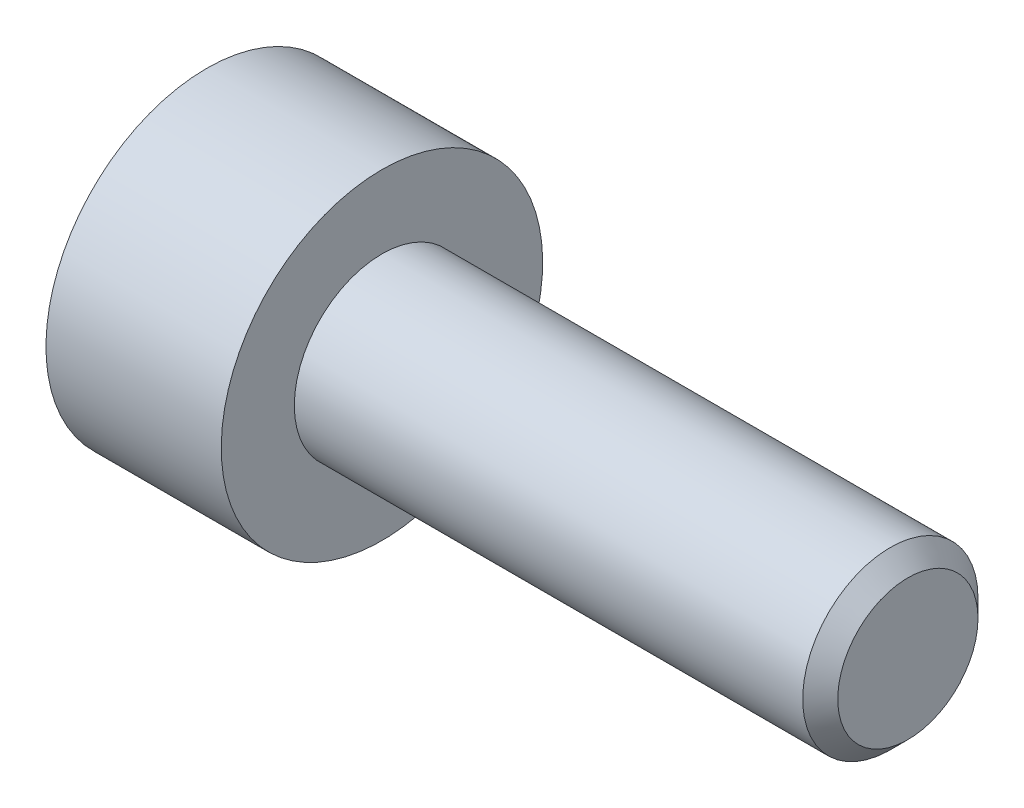
ISO-10303-21;
HEADER;
FILE_DESCRIPTION(('STEP AP214'),'2;1');
FILE_NAME('part.step','',(''),(''),'','','');
FILE_SCHEMA(('AUTOMOTIVE_DESIGN { 1 0 10303 214 1 1 1 1 }'));
ENDSEC;
DATA;
#1=APPLICATION_CONTEXT('core data for automotive mechanical design processes');
#2=APPLICATION_PROTOCOL_DEFINITION('international standard','automotive_design',2000,#1);
#3=PRODUCT_CONTEXT('',#1,'mechanical');
#4=PRODUCT('Part','Part','',(#3));
#5=PRODUCT_RELATED_PRODUCT_CATEGORY('part','',(#4));
#6=PRODUCT_DEFINITION_FORMATION('','',#4);
#7=PRODUCT_DEFINITION_CONTEXT('part definition',#1,'design');
#8=PRODUCT_DEFINITION('design','',#6,#7);
#9=PRODUCT_DEFINITION_SHAPE('','',#8);
#10=(LENGTH_UNIT() NAMED_UNIT(*) SI_UNIT(.MILLI.,.METRE.));
#11=(NAMED_UNIT(*) PLANE_ANGLE_UNIT() SI_UNIT($,.RADIAN.));
#12=(NAMED_UNIT(*) SI_UNIT($,.STERADIAN.) SOLID_ANGLE_UNIT());
#13=UNCERTAINTY_MEASURE_WITH_UNIT(LENGTH_MEASURE(1.E-05),#10,'distance_accuracy_value','');
#14=(GEOMETRIC_REPRESENTATION_CONTEXT(3) GLOBAL_UNCERTAINTY_ASSIGNED_CONTEXT((#13)) GLOBAL_UNIT_ASSIGNED_CONTEXT((#10,
#11,#12)) REPRESENTATION_CONTEXT('',''));
#15=CARTESIAN_POINT('',(0.,0.,0.));
#16=DIRECTION('',(0.,0.,1.));
#17=DIRECTION('',(1.,0.,0.));
#18=AXIS2_PLACEMENT_3D('',#15,#16,#17);
#19=CARTESIAN_POINT('',(-9.,0.,0.));
#20=DIRECTION('',(1.,0.,0.));
#21=DIRECTION('',(0.,0.,-1.));
#22=AXIS2_PLACEMENT_3D('',#19,#20,#21);
#23=CYLINDRICAL_SURFACE('',#22,1.5);
#24=CARTESIAN_POINT('',(-0.299999999999998,0.,0.));
#25=DIRECTION('',(1.,0.,0.));
#26=DIRECTION('',(0.,0.,-1.));
#27=AXIS2_PLACEMENT_3D('',#24,#25,#26);
#28=CIRCLE('',#27,1.5);
#29=CARTESIAN_POINT('',(-0.299999999999998,0.,-1.5));
#30=VERTEX_POINT('',#29);
#31=EDGE_CURVE('E55',#30,#30,#28,.F.);
#32=ORIENTED_EDGE('',*,*,#31,.T.);
#33=EDGE_LOOP('',(#32));
#34=FACE_BOUND('',#33,.T.);
#35=CARTESIAN_POINT('',(-9.,0.,0.));
#36=DIRECTION('',(1.,0.,0.));
#37=DIRECTION('',(0.,1.,0.));
#38=AXIS2_PLACEMENT_3D('',#35,#36,#37);
#39=CIRCLE('',#38,1.5);
#40=CARTESIAN_POINT('',(-9.,1.49999999999999,0.));
#41=VERTEX_POINT('',#40);
#42=EDGE_CURVE('E131',#41,#41,#39,.F.);
#43=ORIENTED_EDGE('',*,*,#42,.F.);
#44=EDGE_LOOP('',(#43));
#45=FACE_BOUND('',#44,.T.);
#46=ADVANCED_FACE('F41',(#34,#45),#23,.T.);
#47=CARTESIAN_POINT('',(0.,0.,0.));
#48=DIRECTION('',(1.,0.,0.));
#49=DIRECTION('',(0.,0.,-1.));
#50=AXIS2_PLACEMENT_3D('',#47,#48,#49);
#51=PLANE('',#50);
#52=CARTESIAN_POINT('',(0.,0.,0.));
#53=DIRECTION('',(1.,0.,0.));
#54=DIRECTION('',(0.,0.,-1.));
#55=AXIS2_PLACEMENT_3D('',#52,#53,#54);
#56=CIRCLE('',#55,1.2);
#57=CARTESIAN_POINT('',(0.,0.,-1.2));
#58=VERTEX_POINT('',#57);
#59=EDGE_CURVE('E134',#58,#58,#56,.T.);
#60=ORIENTED_EDGE('',*,*,#59,.T.);
#61=EDGE_LOOP('',(#60));
#62=FACE_BOUND('',#61,.T.);
#63=ADVANCED_FACE('F144',(#62),#51,.T.);
#64=CARTESIAN_POINT('',(0.,0.,0.));
#65=DIRECTION('',(-1.,0.,0.));
#66=DIRECTION('',(0.,0.,1.));
#67=AXIS2_PLACEMENT_3D('',#64,#65,#66);
#68=CONICAL_SURFACE('',#67,1.2,0.785398163397449);
#69=ORIENTED_EDGE('',*,*,#31,.F.);
#70=EDGE_LOOP('',(#69));
#71=FACE_BOUND('',#70,.T.);
#72=ORIENTED_EDGE('',*,*,#59,.F.);
#73=EDGE_LOOP('',(#72));
#74=FACE_BOUND('',#73,.T.);
#75=ADVANCED_FACE('F43',(#71,#74),#68,.T.);
#76=CARTESIAN_POINT('',(-12.,0.,0.));
#77=DIRECTION('',(-1.,0.,0.));
#78=DIRECTION('',(0.,-1.,0.));
#79=AXIS2_PLACEMENT_3D('',#76,#77,#78);
#80=PLANE('',#79);
#81=CARTESIAN_POINT('',(-12.,0.,0.));
#82=DIRECTION('',(-1.,0.,0.));
#83=DIRECTION('',(0.,-1.,0.));
#84=AXIS2_PLACEMENT_3D('',#81,#82,#83);
#85=CIRCLE('',#84,1.49337567297408);
#86=CARTESIAN_POINT('',(-12.,-1.49337567297405,0.));
#87=VERTEX_POINT('',#86);
#88=EDGE_CURVE('E249',#87,#87,#85,.T.);
#89=ORIENTED_EDGE('',*,*,#88,.F.);
#90=EDGE_LOOP('',(#89));
#91=FACE_BOUND('',#90,.T.);
#92=CARTESIAN_POINT('',(-12.,0.,0.));
#93=DIRECTION('',(1.,0.,0.));
#94=DIRECTION('',(0.,1.,0.));
#95=AXIS2_PLACEMENT_3D('',#92,#93,#94);
#96=CIRCLE('',#95,2.75);
#97=CARTESIAN_POINT('',(-12.,2.75,0.));
#98=VERTEX_POINT('',#97);
#99=EDGE_CURVE('E128',#98,#98,#96,.T.);
#100=ORIENTED_EDGE('',*,*,#99,.F.);
#101=EDGE_LOOP('',(#100));
#102=FACE_BOUND('',#101,.T.);
#103=ADVANCED_FACE('F143',(#91,#102),#80,.T.);
#104=CARTESIAN_POINT('',(-9.,0.,0.));
#105=DIRECTION('',(1.,0.,0.));
#106=DIRECTION('',(0.,1.,0.));
#107=AXIS2_PLACEMENT_3D('',#104,#105,#106);
#108=CYLINDRICAL_SURFACE('',#107,2.75);
#109=ORIENTED_EDGE('',*,*,#99,.T.);
#110=EDGE_LOOP('',(#109));
#111=FACE_BOUND('',#110,.T.);
#112=CARTESIAN_POINT('',(-9.,0.,0.));
#113=DIRECTION('',(1.,0.,0.));
#114=DIRECTION('',(0.,1.,0.));
#115=AXIS2_PLACEMENT_3D('',#112,#113,#114);
#116=CIRCLE('',#115,2.75);
#117=CARTESIAN_POINT('',(-9.,2.75,0.));
#118=VERTEX_POINT('',#117);
#119=EDGE_CURVE('E125',#118,#118,#116,.T.);
#120=ORIENTED_EDGE('',*,*,#119,.F.);
#121=EDGE_LOOP('',(#120));
#122=FACE_BOUND('',#121,.T.);
#123=ADVANCED_FACE('F155',(#111,#122),#108,.T.);
#124=CARTESIAN_POINT('',(-9.,2.75,0.));
#125=DIRECTION('',(1.,0.,0.));
#126=DIRECTION('',(0.,1.,0.));
#127=AXIS2_PLACEMENT_3D('',#124,#125,#126);
#128=PLANE('',#127);
#129=ORIENTED_EDGE('',*,*,#42,.T.);
#130=EDGE_LOOP('',(#129));
#131=FACE_BOUND('',#130,.T.);
#132=ORIENTED_EDGE('',*,*,#119,.T.);
#133=EDGE_LOOP('',(#132));
#134=FACE_BOUND('',#133,.T.);
#135=ADVANCED_FACE('F159',(#131,#134),#128,.T.);
#136=CARTESIAN_POINT('',(-12.,0.,0.));
#137=DIRECTION('',(-1.,0.,0.));
#138=DIRECTION('',(0.,-1.,0.));
#139=AXIS2_PLACEMENT_3D('',#136,#137,#138);
#140=CONICAL_SURFACE('',#139,1.49337567297408,0.78539816339745);
#141=ORIENTED_EDGE('',*,*,#88,.T.);
#142=EDGE_LOOP('',(#141));
#143=FACE_BOUND('',#142,.T.);
#144=CARTESIAN_POINT('',(-12.4014021689884,-1.42396736984798,1.25));
#145=CARTESIAN_POINT('',(-12.375296136448,-1.38922450814774,1.25));
#146=CARTESIAN_POINT('',(-12.3494506563431,-1.35428640192996,1.25));
#147=CARTESIAN_POINT('',(-12.2983879120234,-1.28394100441962,1.25));
#148=CARTESIAN_POINT('',(-12.2731708093588,-1.24853359598576,1.25));
#149=CARTESIAN_POINT('',(-12.1982633539511,-1.1409714001612,1.25));
#150=CARTESIAN_POINT('',(-12.1497190435972,-1.0680049582675,1.25));
#151=CARTESIAN_POINT('',(-12.0545600162985,-0.915095472420351,1.25));
#152=CARTESIAN_POINT('',(-12.0082030382604,-0.834990154954494,1.25));
#153=CARTESIAN_POINT('',(-11.9235039270025,-0.670798348959411,1.25));
#154=CARTESIAN_POINT('',(-11.8851347978723,-0.586726487937158,1.25));
#155=CARTESIAN_POINT('',(-11.8381985020476,-0.460385334768696,1.25));
#156=CARTESIAN_POINT('',(-11.8247021207698,-0.419954113336602,1.25));
#157=CARTESIAN_POINT('',(-11.8009573074475,-0.33812903129128,1.25));
#158=CARTESIAN_POINT('',(-11.7907091035293,-0.296735103284172,1.25));
#159=CARTESIAN_POINT('',(-11.7741594663552,-0.213916243687786,1.25));
#160=CARTESIAN_POINT('',(-11.7677913385525,-0.172504848949334,1.25));
#161=CARTESIAN_POINT('',(-11.7591237196608,-0.0892560954741912,1.25));
#162=CARTESIAN_POINT('',(-11.7568235599982,-0.0474188078702989,1.25));
#163=CARTESIAN_POINT('',(-11.7564564105193,0.0348235296905082,1.25));
#164=CARTESIAN_POINT('',(-11.7582455485416,0.0752279922916852,1.25));
#165=CARTESIAN_POINT('',(-11.7656448035135,0.155687005579614,1.25));
#166=CARTESIAN_POINT('',(-11.7712556629701,0.195741486737968,1.25));
#167=CARTESIAN_POINT('',(-11.7860898151071,0.275882483894676,1.25));
#168=CARTESIAN_POINT('',(-11.7953738895404,0.31595757967878,1.25));
#169=CARTESIAN_POINT('',(-11.8170656964992,0.395234027395288,1.25));
#170=CARTESIAN_POINT('',(-11.8294731489784,0.434435457318928,1.25));
#171=CARTESIAN_POINT('',(-11.8734108304631,0.558570325397127,1.25));
#172=CARTESIAN_POINT('',(-11.9099744143289,0.641718054005948,1.25));
#173=CARTESIAN_POINT('',(-11.9912478873066,0.804100725662089,1.25));
#174=CARTESIAN_POINT('',(-12.0359871895297,0.883320183915879,1.25));
#175=CARTESIAN_POINT('',(-12.1282652286461,1.03470895505823,1.25));
#176=CARTESIAN_POINT('',(-12.1755534388818,1.10703287925038,1.25));
#177=CARTESIAN_POINT('',(-12.2486463209253,1.21358798649192,1.25));
#178=CARTESIAN_POINT('',(-12.2732664432996,1.24864609054882,1.25));
#179=CARTESIAN_POINT('',(-12.323155260131,1.31828380805649,1.25));
#180=CARTESIAN_POINT('',(-12.3484237758017,1.35286354944694,1.25));
#181=CARTESIAN_POINT('',(-12.3739610581168,1.38724419886388,1.25));
#182=B_SPLINE_CURVE_WITH_KNOTS('',3,(#144,#145,#146,#147,#148,#149,#150,#151,#152,#153,#154,
#155,#156,#157,#158,#159,#160,#161,#162,#163,#164,#165,#166,#167,#168,#169,#170,#171,#172,#173,
#174,#175,#176,#177,#178,#179,#180,#181),.UNSPECIFIED.,.F.,.F.,(4,2,2,2,2,2,2,2,2,2,2,2,2,2,2,2,
2,2,4),(0.,0.130370422461748,0.260774023229279,0.523571931962181,0.800995227642792,
1.07746514553942,1.20522972687283,1.33300327939672,1.45851355132216,1.5840031936199,
1.70514602294322,1.82631239533597,1.94957373840993,2.07282403363807,2.34451838945522,
2.61721016161585,2.87631588769063,3.00482945023601,3.13330794967363),.UNSPECIFIED.);
#183=CARTESIAN_POINT('',(-11.95,-0.721687836486997,1.25));
#184=VERTEX_POINT('',#183);
#185=CARTESIAN_POINT('',(-11.95,0.721687836487068,1.25));
#186=VERTEX_POINT('',#185);
#187=EDGE_CURVE('E109',#184,#186,#182,.T.);
#188=ORIENTED_EDGE('',*,*,#187,.F.);
#189=CARTESIAN_POINT('',(-11.9501154839091,-1.44349114302787,-0.000200000000000609));
#190=CARTESIAN_POINT('',(-11.9253216680551,-1.41867941875062,0.0427751670715862));
#191=CARTESIAN_POINT('',(-11.9019837344187,-1.3934527698074,0.0864690047459474));
#192=CARTESIAN_POINT('',(-11.8592520040845,-1.34201263554191,0.175565930841941));
#193=CARTESIAN_POINT('',(-11.8398819923604,-1.31579425481273,0.220977498357063));
#194=CARTESIAN_POINT('',(-11.8067004834135,-1.26292610442243,0.312547820935259));
#195=CARTESIAN_POINT('',(-11.7928055590526,-1.23628980770467,0.358683240175885));
#196=CARTESIAN_POINT('',(-11.7713972821606,-1.18243062538505,0.451970080407592));
#197=CARTESIAN_POINT('',(-11.7638679415668,-1.15520938653758,0.499118649136379));
#198=CARTESIAN_POINT('',(-11.7570744980507,-1.10829684367463,0.580373556887252));
#199=CARTESIAN_POINT('',(-11.7560685591043,-1.08866617256954,0.61437487662794));
#200=CARTESIAN_POINT('',(-11.7577614149113,-1.04943932800607,0.682317764432477));
#201=CARTESIAN_POINT('',(-11.7604610272155,-1.02984316311596,0.716259317655657));
#202=CARTESIAN_POINT('',(-11.7694089303164,-0.990839954603464,0.783814856457499));
#203=CARTESIAN_POINT('',(-11.7756605258997,-0.971433104248736,0.817428507286774));
#204=CARTESIAN_POINT('',(-11.7913756814139,-0.93294339560987,0.884094638217813));
#205=CARTESIAN_POINT('',(-11.8008406200874,-0.913860680098265,0.917146871030295));
#206=CARTESIAN_POINT('',(-11.8289313906876,-0.864986351354532,1.00179969160026));
#207=CARTESIAN_POINT('',(-11.8496701574522,-0.83550292014904,1.05286649242964));
#208=CARTESIAN_POINT('',(-11.8963871346715,-0.777690319475873,1.15300085411325));
#209=CARTESIAN_POINT('',(-11.9223482959468,-0.749357745598381,1.20207431157827));
#210=CARTESIAN_POINT('',(-11.9501154839091,-0.721572366433159,1.2502));
#211=B_SPLINE_CURVE_WITH_KNOTS('',3,(#189,#190,#191,#192,#193,#194,#195,#196,#197,#198,#199,
#200,#201,#202,#203,#204,#205,#206,#207,#208,#209,#210),.UNSPECIFIED.,.F.,.F.,(4,2,2,2,2,2,2,2,
2,2,4),(0.,0.166533409618303,0.334037607289761,0.498880396489698,0.663307919240275,
0.780963963458827,0.898645970148453,1.01643764860773,1.1342799317155,1.32148652032141,
1.50809158792574),.UNSPECIFIED.);
#212=CARTESIAN_POINT('',(-11.95,-1.44337567297403,0.));
#213=VERTEX_POINT('',#212);
#214=EDGE_CURVE('E205',#213,#184,#211,.T.);
#215=ORIENTED_EDGE('',*,*,#214,.F.);
#216=CARTESIAN_POINT('',(-11.9501154839091,-0.721572366433158,-1.2502));
#217=CARTESIAN_POINT('',(-11.9253216680551,-0.746384090710407,-1.20722483292841));
#218=CARTESIAN_POINT('',(-11.9019837344187,-0.771610739653628,-1.16353099525405));
#219=CARTESIAN_POINT('',(-11.8592520040845,-0.823050873919118,-1.07443406915806));
#220=CARTESIAN_POINT('',(-11.8398819923604,-0.849269254648297,-1.02902250164294));
#221=CARTESIAN_POINT('',(-11.8067004834135,-0.902137405038599,-0.937452179064741));
#222=CARTESIAN_POINT('',(-11.7928055590526,-0.928773701756351,-0.891316759824115));
#223=CARTESIAN_POINT('',(-11.7713972821606,-0.982632884075976,-0.798029919592408));
#224=CARTESIAN_POINT('',(-11.7638679415668,-1.00985412292345,-0.750881350863621));
#225=CARTESIAN_POINT('',(-11.7570744980507,-1.05676666578639,-0.669626443112748));
#226=CARTESIAN_POINT('',(-11.7560685591043,-1.07639733689148,-0.63562512337206));
#227=CARTESIAN_POINT('',(-11.7577614149113,-1.11562418145495,-0.567682235567523));
#228=CARTESIAN_POINT('',(-11.7604610272155,-1.13522034634507,-0.533740682344343));
#229=CARTESIAN_POINT('',(-11.7694089303164,-1.17422355485756,-0.466185143542501));
#230=CARTESIAN_POINT('',(-11.7756605258997,-1.19363040521229,-0.432571492713226));
#231=CARTESIAN_POINT('',(-11.7913756814139,-1.23212011385116,-0.365905361782188));
#232=CARTESIAN_POINT('',(-11.8008406200874,-1.25120282936276,-0.332853128969705));
#233=CARTESIAN_POINT('',(-11.8289313906876,-1.30007715810649,-0.248200308399736));
#234=CARTESIAN_POINT('',(-11.8496701574522,-1.32956058931199,-0.197133507570362));
#235=CARTESIAN_POINT('',(-11.8963871346715,-1.38737318998515,-0.0969991458867454));
#236=CARTESIAN_POINT('',(-11.9223482959468,-1.41570576386264,-0.0479256884217309));
#237=CARTESIAN_POINT('',(-11.9501154839091,-1.44349114302787,0.000199999999999419));
#238=B_SPLINE_CURVE_WITH_KNOTS('',3,(#216,#217,#218,#219,#220,#221,#222,#223,#224,#225,#226,
#227,#228,#229,#230,#231,#232,#233,#234,#235,#236,#237),.UNSPECIFIED.,.F.,.F.,(4,2,2,2,2,2,2,2,
2,2,4),(0.,0.166533409618304,0.334037607289761,0.498880396489697,0.663307919240274,
0.780963963458826,0.898645970148452,1.01643764860773,1.13427993171549,1.32148652032141,
1.50809158792573),.UNSPECIFIED.);
#239=CARTESIAN_POINT('',(-11.95,-0.721687836486996,-1.25));
#240=VERTEX_POINT('',#239);
#241=EDGE_CURVE('E199',#240,#213,#238,.T.);
#242=ORIENTED_EDGE('',*,*,#241,.F.);
#243=CARTESIAN_POINT('',(-12.4014021689884,-1.42396736984798,-1.25));
#244=CARTESIAN_POINT('',(-12.375296136448,-1.38922450814774,-1.25));
#245=CARTESIAN_POINT('',(-12.3494506563431,-1.35428640192996,-1.25));
#246=CARTESIAN_POINT('',(-12.2983879120234,-1.28394100441962,-1.25));
#247=CARTESIAN_POINT('',(-12.2731708093588,-1.24853359598576,-1.25));
#248=CARTESIAN_POINT('',(-12.1982633539511,-1.14097140016119,-1.25));
#249=CARTESIAN_POINT('',(-12.1497190435972,-1.0680049582675,-1.25));
#250=CARTESIAN_POINT('',(-12.0545600162985,-0.915095472420349,-1.25));
#251=CARTESIAN_POINT('',(-12.0082030382604,-0.834990154954492,-1.25));
#252=CARTESIAN_POINT('',(-11.9235039270025,-0.670798348959409,-1.25));
#253=CARTESIAN_POINT('',(-11.8851347978723,-0.586726487937157,-1.25));
#254=CARTESIAN_POINT('',(-11.8381985020476,-0.460385334768694,-1.25));
#255=CARTESIAN_POINT('',(-11.8247021207698,-0.4199541133366,-1.25));
#256=CARTESIAN_POINT('',(-11.8009573074475,-0.338129031291279,-1.25));
#257=CARTESIAN_POINT('',(-11.7907091035293,-0.296735103284172,-1.25));
#258=CARTESIAN_POINT('',(-11.7741594663552,-0.213916243687786,-1.25));
#259=CARTESIAN_POINT('',(-11.7677913385525,-0.172504848949334,-1.25));
#260=CARTESIAN_POINT('',(-11.7591237196608,-0.089256095474191,-1.25));
#261=CARTESIAN_POINT('',(-11.7568235599982,-0.0474188078702988,-1.25));
#262=CARTESIAN_POINT('',(-11.7564564105193,0.0348235296905082,-1.25));
#263=CARTESIAN_POINT('',(-11.7582455485416,0.0752279922916852,-1.25));
#264=CARTESIAN_POINT('',(-11.7656448035135,0.155687005579614,-1.25));
#265=CARTESIAN_POINT('',(-11.7712556629701,0.195741486737968,-1.25));
#266=CARTESIAN_POINT('',(-11.7860898151071,0.275882483894676,-1.25));
#267=CARTESIAN_POINT('',(-11.7953738895404,0.31595757967878,-1.25));
#268=CARTESIAN_POINT('',(-11.8170656964992,0.395234027395288,-1.25));
#269=CARTESIAN_POINT('',(-11.8294731489784,0.434435457318928,-1.25));
#270=CARTESIAN_POINT('',(-11.8734108304631,0.558570325397127,-1.25));
#271=CARTESIAN_POINT('',(-11.9099744143289,0.641718054005948,-1.25));
#272=CARTESIAN_POINT('',(-11.9912478873066,0.80410072566209,-1.25));
#273=CARTESIAN_POINT('',(-12.0359871895297,0.88332018391588,-1.25));
#274=CARTESIAN_POINT('',(-12.1282652286461,1.03470895505823,-1.25));
#275=CARTESIAN_POINT('',(-12.1755534388818,1.10703287925038,-1.25));
#276=CARTESIAN_POINT('',(-12.2486463209253,1.21358798649192,-1.25));
#277=CARTESIAN_POINT('',(-12.2732664432996,1.24864609054882,-1.25));
#278=CARTESIAN_POINT('',(-12.323155260131,1.31828380805649,-1.25));
#279=CARTESIAN_POINT('',(-12.3484237758017,1.35286354944694,-1.25));
#280=CARTESIAN_POINT('',(-12.3739610581168,1.38724419886388,-1.25));
#281=B_SPLINE_CURVE_WITH_KNOTS('',3,(#243,#244,#245,#246,#247,#248,#249,#250,#251,#252,#253,
#254,#255,#256,#257,#258,#259,#260,#261,#262,#263,#264,#265,#266,#267,#268,#269,#270,#271,#272,
#273,#274,#275,#276,#277,#278,#279,#280),.UNSPECIFIED.,.F.,.F.,(4,2,2,2,2,2,2,2,2,2,2,2,2,2,2,2,
2,2,4),(0.,0.130370422461749,0.26077402322928,0.523571931962181,0.800995227642792,
1.07746514553942,1.20522972687283,1.33300327939672,1.45851355132216,1.5840031936199,
1.70514602294322,1.82631239533597,1.94957373840992,2.07282403363807,2.34451838945522,
2.61721016161585,2.87631588769062,3.004829450236,3.13330794967362),.UNSPECIFIED.);
#282=CARTESIAN_POINT('',(-11.95,0.721687836487068,-1.25));
#283=VERTEX_POINT('',#282);
#284=EDGE_CURVE('E62',#283,#240,#281,.F.);
#285=ORIENTED_EDGE('',*,*,#284,.F.);
#286=CARTESIAN_POINT('',(-11.9501154839091,1.44349114302794,0.000200000000000217));
#287=CARTESIAN_POINT('',(-11.9253216680551,1.41867941875069,-0.0427751670715868));
#288=CARTESIAN_POINT('',(-11.9019837344187,1.39345276980747,-0.0864690047459477));
#289=CARTESIAN_POINT('',(-11.8592520040845,1.34201263554198,-0.175565930841941));
#290=CARTESIAN_POINT('',(-11.8398819923604,1.3157942548128,-0.220977498357063));
#291=CARTESIAN_POINT('',(-11.8067004834135,1.2629261044225,-0.312547820935258));
#292=CARTESIAN_POINT('',(-11.7928055590526,1.23628980770475,-0.358683240175884));
#293=CARTESIAN_POINT('',(-11.7713972821606,1.18243062538512,-0.451970080407591));
#294=CARTESIAN_POINT('',(-11.7638679415668,1.15520938653765,-0.499118649136379));
#295=CARTESIAN_POINT('',(-11.7570744980507,1.1082968436747,-0.580373556887251));
#296=CARTESIAN_POINT('',(-11.7560685591043,1.08866617256962,-0.61437487662794));
#297=CARTESIAN_POINT('',(-11.7577614149113,1.04943932800615,-0.682317764432476));
#298=CARTESIAN_POINT('',(-11.7604610272155,1.02984316311603,-0.716259317655656));
#299=CARTESIAN_POINT('',(-11.7694089303164,0.990839954603535,-0.783814856457498));
#300=CARTESIAN_POINT('',(-11.7756605258997,0.971433104248807,-0.817428507286774));
#301=CARTESIAN_POINT('',(-11.7913756814139,0.932943395609941,-0.884094638217812));
#302=CARTESIAN_POINT('',(-11.8008406200874,0.913860680098336,-0.917146871030294));
#303=CARTESIAN_POINT('',(-11.8289313906876,0.864986351354604,-1.00179969160026));
#304=CARTESIAN_POINT('',(-11.8496701574522,0.835502920149112,-1.05286649242964));
#305=CARTESIAN_POINT('',(-11.8963871346715,0.777690319475945,-1.15300085411325));
#306=CARTESIAN_POINT('',(-11.9223482959467,0.749357745598453,-1.20207431157827));
#307=CARTESIAN_POINT('',(-11.9501154839091,0.72157236643323,-1.2502));
#308=B_SPLINE_CURVE_WITH_KNOTS('',3,(#286,#287,#288,#289,#290,#291,#292,#293,#294,#295,#296,
#297,#298,#299,#300,#301,#302,#303,#304,#305,#306,#307),.UNSPECIFIED.,.F.,.F.,(4,2,2,2,2,2,2,2,
2,2,4),(0.,0.166533409618302,0.334037607289761,0.498880396489696,0.663307919240273,
0.780963963458825,0.898645970148451,1.01643764860773,1.13427993171549,1.32148652032141,
1.50809158792574),.UNSPECIFIED.);
#309=CARTESIAN_POINT('',(-11.95,1.4433756729741,0.));
#310=VERTEX_POINT('',#309);
#311=EDGE_CURVE('E11',#310,#283,#308,.T.);
#312=ORIENTED_EDGE('',*,*,#311,.F.);
#313=CARTESIAN_POINT('',(-11.9501154839091,0.72157236643323,1.2502));
#314=CARTESIAN_POINT('',(-11.9253216680551,0.74638409071048,1.20722483292841));
#315=CARTESIAN_POINT('',(-11.9019837344187,0.7716107396537,1.16353099525405));
#316=CARTESIAN_POINT('',(-11.8592520040845,0.82305087391919,1.07443406915806));
#317=CARTESIAN_POINT('',(-11.8398819923604,0.849269254648368,1.02902250164294));
#318=CARTESIAN_POINT('',(-11.8067004834135,0.90213740503867,0.93745217906474));
#319=CARTESIAN_POINT('',(-11.7928055590526,0.928773701756422,0.891316759824114));
#320=CARTESIAN_POINT('',(-11.7713972821606,0.982632884076047,0.798029919592407));
#321=CARTESIAN_POINT('',(-11.7638679415668,1.00985412292352,0.75088135086362));
#322=CARTESIAN_POINT('',(-11.7570744980507,1.05676666578646,0.669626443112748));
#323=CARTESIAN_POINT('',(-11.7560685591043,1.07639733689155,0.635625123372059));
#324=CARTESIAN_POINT('',(-11.7577614149113,1.11562418145502,0.567682235567522));
#325=CARTESIAN_POINT('',(-11.7604610272155,1.13522034634514,0.533740682344342));
#326=CARTESIAN_POINT('',(-11.7694089303164,1.17422355485763,0.466185143542501));
#327=CARTESIAN_POINT('',(-11.7756605258997,1.19363040521236,0.432571492713225));
#328=CARTESIAN_POINT('',(-11.7913756814139,1.23212011385123,0.365905361782187));
#329=CARTESIAN_POINT('',(-11.8008406200874,1.25120282936283,0.332853128969705));
#330=CARTESIAN_POINT('',(-11.8289313906876,1.30007715810656,0.248200308399736));
#331=CARTESIAN_POINT('',(-11.8496701574522,1.32956058931206,0.197133507570363));
#332=CARTESIAN_POINT('',(-11.8963871346715,1.38737318998522,0.096999145886746));
#333=CARTESIAN_POINT('',(-11.9223482959467,1.41570576386272,0.0479256884217308));
#334=CARTESIAN_POINT('',(-11.9501154839091,1.44349114302794,-0.000200000000000093));
#335=B_SPLINE_CURVE_WITH_KNOTS('',3,(#313,#314,#315,#316,#317,#318,#319,#320,#321,#322,#323,
#324,#325,#326,#327,#328,#329,#330,#331,#332,#333,#334),.UNSPECIFIED.,.F.,.F.,(4,2,2,2,2,2,2,2,
2,2,4),(0.,0.166533409618303,0.334037607289761,0.498880396489698,0.663307919240274,
0.780963963458827,0.898645970148452,1.01643764860773,1.13427993171549,1.32148652032141,
1.50809158792574),.UNSPECIFIED.);
#336=EDGE_CURVE('E100',#186,#310,#335,.T.);
#337=ORIENTED_EDGE('',*,*,#336,.F.);
#338=EDGE_LOOP('',(#188,#215,#242,#285,#312,#337));
#339=FACE_BOUND('',#338,.T.);
#340=ADVANCED_FACE('F99',(#143,#339),#140,.F.);
#341=CARTESIAN_POINT('',(-10.4,0.,0.));
#342=DIRECTION('',(-1.,0.,0.));
#343=DIRECTION('',(0.,-1.,0.));
#344=AXIS2_PLACEMENT_3D('',#341,#342,#343);
#345=PLANE('',#344);
#346=DIRECTION('',(0.,0.5,-0.866025403784438));
#347=VECTOR('',#346,1.);
#348=CARTESIAN_POINT('',(-10.4,0.721687836487062,1.25));
#349=LINE('',#348,#347);
#350=CARTESIAN_POINT('',(-10.4,0.721687836487062,1.25));
#351=VERTEX_POINT('',#350);
#352=CARTESIAN_POINT('',(-10.4,1.44337567297409,0.));
#353=VERTEX_POINT('',#352);
#354=EDGE_CURVE('E108',#351,#353,#349,.T.);
#355=ORIENTED_EDGE('',*,*,#354,.T.);
#356=DIRECTION('',(0.,-0.5,-0.866025403784439));
#357=VECTOR('',#356,1.);
#358=CARTESIAN_POINT('',(-10.4,1.44337567297409,0.));
#359=LINE('',#358,#357);
#360=CARTESIAN_POINT('',(-10.4,0.721687836487062,-1.25));
#361=VERTEX_POINT('',#360);
#362=EDGE_CURVE('E113',#353,#361,#359,.T.);
#363=ORIENTED_EDGE('',*,*,#362,.T.);
#364=DIRECTION('',(0.,-1.,0.));
#365=VECTOR('',#364,1.);
#366=CARTESIAN_POINT('',(-10.4,0.721687836487062,-1.25));
#367=LINE('',#366,#365);
#368=CARTESIAN_POINT('',(-10.4,-0.721687836487002,-1.25));
#369=VERTEX_POINT('',#368);
#370=EDGE_CURVE('E231',#361,#369,#367,.T.);
#371=ORIENTED_EDGE('',*,*,#370,.T.);
#372=DIRECTION('',(0.,-0.5,0.866025403784438));
#373=VECTOR('',#372,1.);
#374=CARTESIAN_POINT('',(-10.4,-0.721687836487002,-1.25));
#375=LINE('',#374,#373);
#376=CARTESIAN_POINT('',(-10.4,-1.44337567297403,0.));
#377=VERTEX_POINT('',#376);
#378=EDGE_CURVE('E235',#369,#377,#375,.T.);
#379=ORIENTED_EDGE('',*,*,#378,.T.);
#380=DIRECTION('',(0.,0.5,0.866025403784439));
#381=VECTOR('',#380,1.);
#382=CARTESIAN_POINT('',(-10.4,-1.44337567297403,0.));
#383=LINE('',#382,#381);
#384=CARTESIAN_POINT('',(-10.4,-0.721687836487003,1.25));
#385=VERTEX_POINT('',#384);
#386=EDGE_CURVE('E121',#377,#385,#383,.T.);
#387=ORIENTED_EDGE('',*,*,#386,.T.);
#388=DIRECTION('',(0.,1.,0.));
#389=VECTOR('',#388,1.);
#390=CARTESIAN_POINT('',(-10.4,-0.721687836487003,1.25));
#391=LINE('',#390,#389);
#392=EDGE_CURVE('E116',#385,#351,#391,.T.);
#393=ORIENTED_EDGE('',*,*,#392,.T.);
#394=EDGE_LOOP('',(#355,#363,#371,#379,#387,#393));
#395=FACE_BOUND('',#394,.T.);
#396=ADVANCED_FACE('F185',(#395),#345,.T.);
#397=CARTESIAN_POINT('',(-10.4,1.44337567297409,0.));
#398=DIRECTION('',(0.,0.866025403784439,-0.5));
#399=DIRECTION('',(0.,0.5,0.866025403784439));
#400=AXIS2_PLACEMENT_3D('',#397,#398,#399);
#401=PLANE('',#400);
#402=DIRECTION('',(-1.,0.,0.));
#403=VECTOR('',#402,1.);
#404=CARTESIAN_POINT('',(-10.4,1.44337567297409,0.));
#405=LINE('',#404,#403);
#406=EDGE_CURVE('E106',#353,#310,#405,.T.);
#407=ORIENTED_EDGE('',*,*,#406,.T.);
#408=ORIENTED_EDGE('',*,*,#311,.T.);
#409=DIRECTION('',(-1.,0.,0.));
#410=VECTOR('',#409,1.);
#411=CARTESIAN_POINT('',(-10.4,0.721687836487062,-1.25));
#412=LINE('',#411,#410);
#413=EDGE_CURVE('E115',#361,#283,#412,.T.);
#414=ORIENTED_EDGE('',*,*,#413,.F.);
#415=ORIENTED_EDGE('',*,*,#362,.F.);
#416=EDGE_LOOP('',(#407,#408,#414,#415));
#417=FACE_BOUND('',#416,.T.);
#418=ADVANCED_FACE('F111',(#417),#401,.F.);
#419=CARTESIAN_POINT('',(-10.4,0.721687836487062,-1.25));
#420=DIRECTION('',(0.,0.,-1.));
#421=DIRECTION('',(-1.,0.,0.));
#422=AXIS2_PLACEMENT_3D('',#419,#420,#421);
#423=PLANE('',#422);
#424=ORIENTED_EDGE('',*,*,#413,.T.);
#425=ORIENTED_EDGE('',*,*,#284,.T.);
#426=DIRECTION('',(-1.,0.,0.));
#427=VECTOR('',#426,1.);
#428=CARTESIAN_POINT('',(-10.4,-0.721687836487002,-1.25));
#429=LINE('',#428,#427);
#430=EDGE_CURVE('E118',#369,#240,#429,.T.);
#431=ORIENTED_EDGE('',*,*,#430,.F.);
#432=ORIENTED_EDGE('',*,*,#370,.F.);
#433=EDGE_LOOP('',(#424,#425,#431,#432));
#434=FACE_BOUND('',#433,.T.);
#435=ADVANCED_FACE('F220',(#434),#423,.F.);
#436=CARTESIAN_POINT('',(-10.4,-0.721687836487002,-1.25));
#437=DIRECTION('',(0.,-0.866025403784438,-0.5));
#438=DIRECTION('',(0.,0.5,-0.866025403784438));
#439=AXIS2_PLACEMENT_3D('',#436,#437,#438);
#440=PLANE('',#439);
#441=ORIENTED_EDGE('',*,*,#430,.T.);
#442=ORIENTED_EDGE('',*,*,#241,.T.);
#443=DIRECTION('',(-1.,0.,0.));
#444=VECTOR('',#443,1.);
#445=CARTESIAN_POINT('',(-10.4,-1.44337567297403,0.));
#446=LINE('',#445,#444);
#447=EDGE_CURVE('E245',#377,#213,#446,.T.);
#448=ORIENTED_EDGE('',*,*,#447,.F.);
#449=ORIENTED_EDGE('',*,*,#378,.F.);
#450=EDGE_LOOP('',(#441,#442,#448,#449));
#451=FACE_BOUND('',#450,.T.);
#452=ADVANCED_FACE('F215',(#451),#440,.F.);
#453=CARTESIAN_POINT('',(-10.4,-1.44337567297403,0.));
#454=DIRECTION('',(0.,-0.866025403784439,0.5));
#455=DIRECTION('',(0.,-0.5,-0.866025403784439));
#456=AXIS2_PLACEMENT_3D('',#453,#454,#455);
#457=PLANE('',#456);
#458=ORIENTED_EDGE('',*,*,#447,.T.);
#459=ORIENTED_EDGE('',*,*,#214,.T.);
#460=DIRECTION('',(-1.,0.,0.));
#461=VECTOR('',#460,1.);
#462=CARTESIAN_POINT('',(-10.4,-0.721687836487003,1.25));
#463=LINE('',#462,#461);
#464=EDGE_CURVE('E242',#385,#184,#463,.T.);
#465=ORIENTED_EDGE('',*,*,#464,.F.);
#466=ORIENTED_EDGE('',*,*,#386,.F.);
#467=EDGE_LOOP('',(#458,#459,#465,#466));
#468=FACE_BOUND('',#467,.T.);
#469=ADVANCED_FACE('F212',(#468),#457,.F.);
#470=CARTESIAN_POINT('',(-10.4,-0.721687836487003,1.25));
#471=DIRECTION('',(0.,0.,1.));
#472=DIRECTION('',(1.,0.,0.));
#473=AXIS2_PLACEMENT_3D('',#470,#471,#472);
#474=PLANE('',#473);
#475=ORIENTED_EDGE('',*,*,#464,.T.);
#476=ORIENTED_EDGE('',*,*,#187,.T.);
#477=DIRECTION('',(-1.,0.,0.));
#478=VECTOR('',#477,1.);
#479=CARTESIAN_POINT('',(-10.4,0.721687836487062,1.25));
#480=LINE('',#479,#478);
#481=EDGE_CURVE('E69',#351,#186,#480,.T.);
#482=ORIENTED_EDGE('',*,*,#481,.F.);
#483=ORIENTED_EDGE('',*,*,#392,.F.);
#484=EDGE_LOOP('',(#475,#476,#482,#483));
#485=FACE_BOUND('',#484,.T.);
#486=ADVANCED_FACE('F166',(#485),#474,.F.);
#487=CARTESIAN_POINT('',(-10.4,0.721687836487062,1.25));
#488=DIRECTION('',(0.,0.866025403784438,0.5));
#489=DIRECTION('',(0.,-0.5,0.866025403784439));
#490=AXIS2_PLACEMENT_3D('',#487,#488,#489);
#491=PLANE('',#490);
#492=ORIENTED_EDGE('',*,*,#481,.T.);
#493=ORIENTED_EDGE('',*,*,#336,.T.);
#494=ORIENTED_EDGE('',*,*,#406,.F.);
#495=ORIENTED_EDGE('',*,*,#354,.F.);
#496=EDGE_LOOP('',(#492,#493,#494,#495));
#497=FACE_BOUND('',#496,.T.);
#498=ADVANCED_FACE('F105',(#497),#491,.F.);
#499=CLOSED_SHELL('',(#46,#63,#75,#103,#123,#135,#340,#396,#418,#435,#452,#469,#486,#498));
#500=MANIFOLD_SOLID_BREP('B2',#499);
#501=ADVANCED_BREP_SHAPE_REPRESENTATION('',(#18,#500),#14);
#502=SHAPE_DEFINITION_REPRESENTATION(#9,#501);
ENDSEC;
END-ISO-10303-21;
